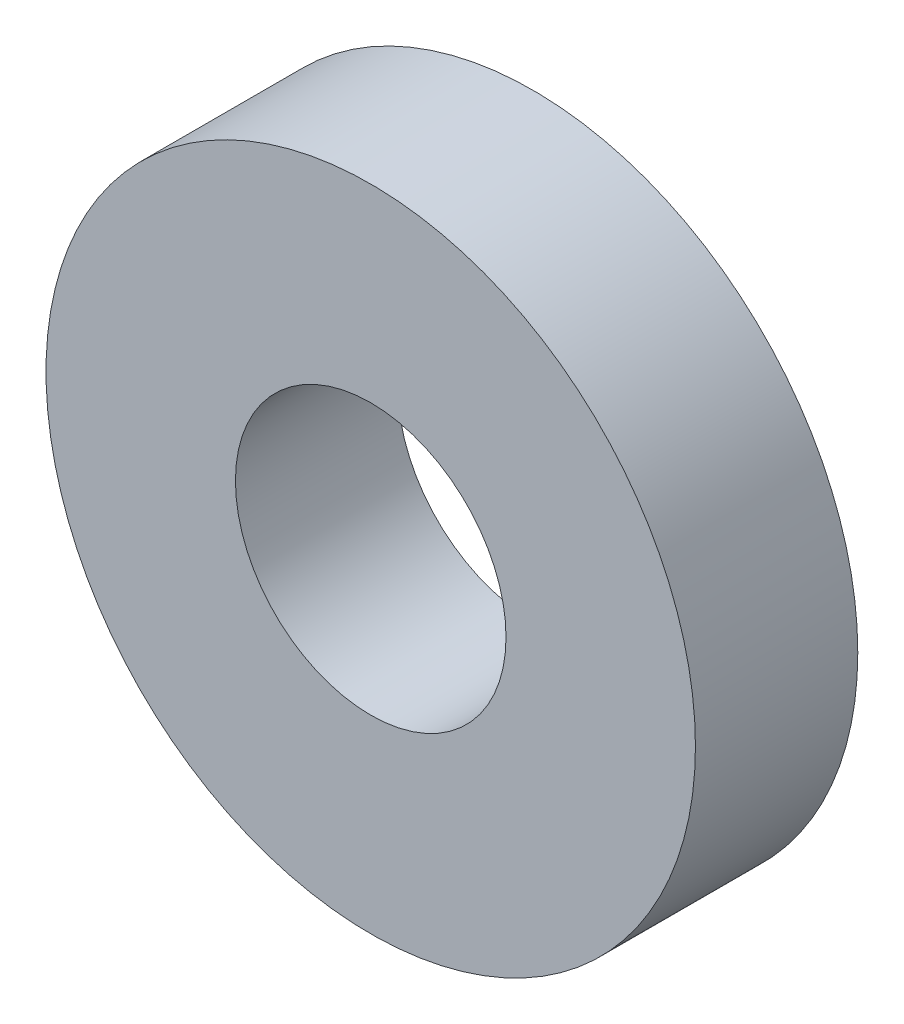
ISO-10303-21;
HEADER;
FILE_DESCRIPTION(('STEP AP214'),'2;1');
FILE_NAME('part.step','',(''),(''),'','','');
FILE_SCHEMA(('AUTOMOTIVE_DESIGN { 1 0 10303 214 1 1 1 1 }'));
ENDSEC;
DATA;
#1=APPLICATION_CONTEXT('core data for automotive mechanical design processes');
#2=APPLICATION_PROTOCOL_DEFINITION('international standard','automotive_design',2000,#1);
#3=PRODUCT_CONTEXT('',#1,'mechanical');
#4=PRODUCT('Part','Part','',(#3));
#5=PRODUCT_RELATED_PRODUCT_CATEGORY('part','',(#4));
#6=PRODUCT_DEFINITION_FORMATION('','',#4);
#7=PRODUCT_DEFINITION_CONTEXT('part definition',#1,'design');
#8=PRODUCT_DEFINITION('design','',#6,#7);
#9=PRODUCT_DEFINITION_SHAPE('','',#8);
#10=(LENGTH_UNIT() NAMED_UNIT(*) SI_UNIT(.MILLI.,.METRE.));
#11=(NAMED_UNIT(*) PLANE_ANGLE_UNIT() SI_UNIT($,.RADIAN.));
#12=(NAMED_UNIT(*) SI_UNIT($,.STERADIAN.) SOLID_ANGLE_UNIT());
#13=UNCERTAINTY_MEASURE_WITH_UNIT(LENGTH_MEASURE(1.E-05),#10,'distance_accuracy_value','');
#14=(GEOMETRIC_REPRESENTATION_CONTEXT(3) GLOBAL_UNCERTAINTY_ASSIGNED_CONTEXT((#13)) GLOBAL_UNIT_ASSIGNED_CONTEXT((#10,
#11,#12)) REPRESENTATION_CONTEXT('',''));
#15=CARTESIAN_POINT('',(0.,0.,0.));
#16=DIRECTION('',(0.,0.,1.));
#17=DIRECTION('',(1.,0.,0.));
#18=AXIS2_PLACEMENT_3D('',#15,#16,#17);
#19=CARTESIAN_POINT('',(0.,0.,30.));
#20=DIRECTION('',(0.,0.,1.));
#21=DIRECTION('',(1.,0.,0.));
#22=AXIS2_PLACEMENT_3D('',#19,#20,#21);
#23=PLANE('',#22);
#24=CARTESIAN_POINT('',(0.,0.,30.));
#25=DIRECTION('',(0.,0.,1.));
#26=DIRECTION('',(1.,0.,0.));
#27=AXIS2_PLACEMENT_3D('',#24,#25,#26);
#28=CIRCLE('',#27,60.);
#29=CARTESIAN_POINT('',(60.,0.,30.));
#30=VERTEX_POINT('',#29);
#31=EDGE_CURVE('E10',#30,#30,#28,.T.);
#32=ORIENTED_EDGE('',*,*,#31,.T.);
#33=EDGE_LOOP('',(#32));
#34=FACE_BOUND('',#33,.T.);
#35=CARTESIAN_POINT('',(0.,0.,30.));
#36=DIRECTION('',(0.,0.,1.));
#37=DIRECTION('',(1.,0.,0.));
#38=AXIS2_PLACEMENT_3D('',#35,#36,#37);
#39=CIRCLE('',#38,25.);
#40=CARTESIAN_POINT('',(25.,0.,30.));
#41=VERTEX_POINT('',#40);
#42=EDGE_CURVE('E48',#41,#41,#39,.T.);
#43=ORIENTED_EDGE('',*,*,#42,.F.);
#44=EDGE_LOOP('',(#43));
#45=FACE_BOUND('',#44,.T.);
#46=ADVANCED_FACE('F37',(#34,#45),#23,.T.);
#47=CARTESIAN_POINT('',(0.,0.,0.));
#48=DIRECTION('',(0.,0.,1.));
#49=DIRECTION('',(1.,0.,0.));
#50=AXIS2_PLACEMENT_3D('',#47,#48,#49);
#51=PLANE('',#50);
#52=CARTESIAN_POINT('',(0.,0.,0.));
#53=DIRECTION('',(0.,0.,1.));
#54=DIRECTION('',(1.,0.,0.));
#55=AXIS2_PLACEMENT_3D('',#52,#53,#54);
#56=CIRCLE('',#55,60.);
#57=CARTESIAN_POINT('',(60.,0.,0.));
#58=VERTEX_POINT('',#57);
#59=EDGE_CURVE('E41',#58,#58,#56,.T.);
#60=ORIENTED_EDGE('',*,*,#59,.F.);
#61=EDGE_LOOP('',(#60));
#62=FACE_BOUND('',#61,.T.);
#63=CARTESIAN_POINT('',(0.,0.,0.));
#64=DIRECTION('',(0.,0.,1.));
#65=DIRECTION('',(1.,0.,0.));
#66=AXIS2_PLACEMENT_3D('',#63,#64,#65);
#67=CIRCLE('',#66,25.);
#68=CARTESIAN_POINT('',(25.,0.,0.));
#69=VERTEX_POINT('',#68);
#70=EDGE_CURVE('E50',#69,#69,#67,.T.);
#71=ORIENTED_EDGE('',*,*,#70,.T.);
#72=EDGE_LOOP('',(#71));
#73=FACE_BOUND('',#72,.T.);
#74=ADVANCED_FACE('F60',(#62,#73),#51,.F.);
#75=CARTESIAN_POINT('',(0.,0.,30.));
#76=DIRECTION('',(0.,0.,-1.));
#77=DIRECTION('',(-1.,0.,0.));
#78=AXIS2_PLACEMENT_3D('',#75,#76,#77);
#79=CYLINDRICAL_SURFACE('',#78,60.);
#80=ORIENTED_EDGE('',*,*,#31,.F.);
#81=EDGE_LOOP('',(#80));
#82=FACE_BOUND('',#81,.T.);
#83=ORIENTED_EDGE('',*,*,#59,.T.);
#84=EDGE_LOOP('',(#83));
#85=FACE_BOUND('',#84,.T.);
#86=ADVANCED_FACE('F39',(#82,#85),#79,.T.);
#87=CARTESIAN_POINT('',(0.,0.,30.));
#88=DIRECTION('',(0.,0.,-1.));
#89=DIRECTION('',(-1.,0.,0.));
#90=AXIS2_PLACEMENT_3D('',#87,#88,#89);
#91=CYLINDRICAL_SURFACE('',#90,25.);
#92=ORIENTED_EDGE('',*,*,#42,.T.);
#93=EDGE_LOOP('',(#92));
#94=FACE_BOUND('',#93,.T.);
#95=ORIENTED_EDGE('',*,*,#70,.F.);
#96=EDGE_LOOP('',(#95));
#97=FACE_BOUND('',#96,.T.);
#98=ADVANCED_FACE('F56',(#94,#97),#91,.F.);
#99=CLOSED_SHELL('',(#46,#74,#86,#98));
#100=MANIFOLD_SOLID_BREP('B2',#99);
#101=ADVANCED_BREP_SHAPE_REPRESENTATION('',(#18,#100),#14);
#102=SHAPE_DEFINITION_REPRESENTATION(#9,#101);
ENDSEC;
END-ISO-10303-21;
